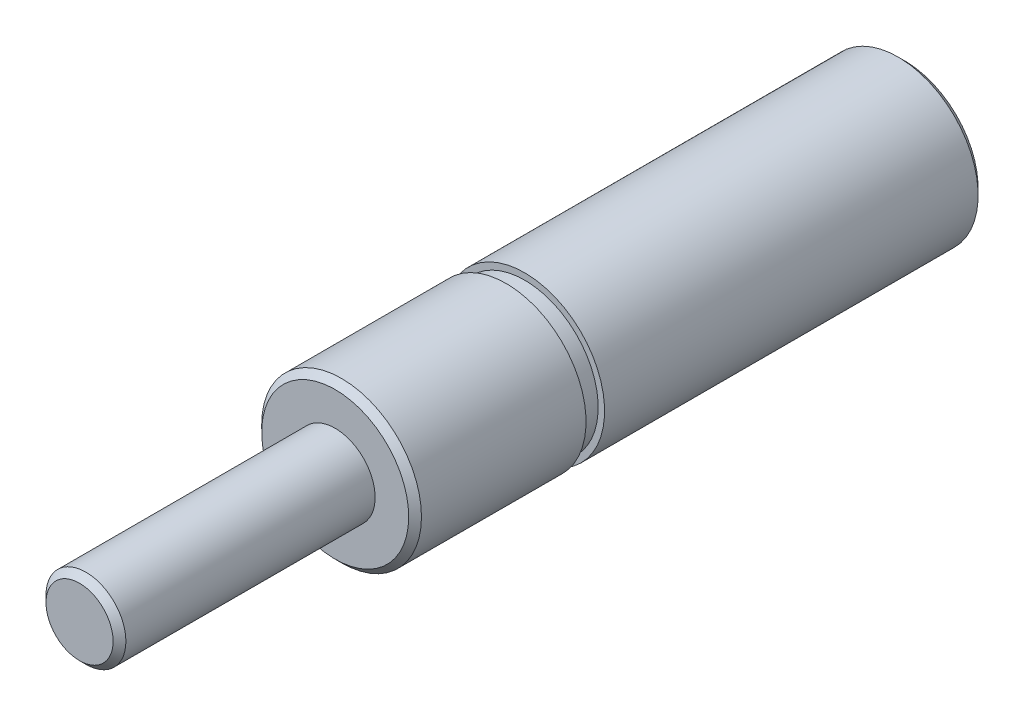
ISO-10303-21;
HEADER;
FILE_DESCRIPTION(('STEP AP214'),'2;1');
FILE_NAME('part.step','',(''),(''),'','','');
FILE_SCHEMA(('AUTOMOTIVE_DESIGN { 1 0 10303 214 1 1 1 1 }'));
ENDSEC;
DATA;
#1=APPLICATION_CONTEXT('core data for automotive mechanical design processes');
#2=APPLICATION_PROTOCOL_DEFINITION('international standard','automotive_design',2000,#1);
#3=PRODUCT_CONTEXT('',#1,'mechanical');
#4=PRODUCT('Part','Part','',(#3));
#5=PRODUCT_RELATED_PRODUCT_CATEGORY('part','',(#4));
#6=PRODUCT_DEFINITION_FORMATION('','',#4);
#7=PRODUCT_DEFINITION_CONTEXT('part definition',#1,'design');
#8=PRODUCT_DEFINITION('design','',#6,#7);
#9=PRODUCT_DEFINITION_SHAPE('','',#8);
#10=(LENGTH_UNIT() NAMED_UNIT(*) SI_UNIT(.MILLI.,.METRE.));
#11=(NAMED_UNIT(*) PLANE_ANGLE_UNIT() SI_UNIT($,.RADIAN.));
#12=(NAMED_UNIT(*) SI_UNIT($,.STERADIAN.) SOLID_ANGLE_UNIT());
#13=UNCERTAINTY_MEASURE_WITH_UNIT(LENGTH_MEASURE(1.E-05),#10,'distance_accuracy_value','');
#14=(GEOMETRIC_REPRESENTATION_CONTEXT(3) GLOBAL_UNCERTAINTY_ASSIGNED_CONTEXT((#13)) GLOBAL_UNIT_ASSIGNED_CONTEXT((#10,
#11,#12)) REPRESENTATION_CONTEXT('',''));
#15=CARTESIAN_POINT('',(0.,0.,0.));
#16=DIRECTION('',(0.,0.,1.));
#17=DIRECTION('',(1.,0.,0.));
#18=AXIS2_PLACEMENT_3D('',#15,#16,#17);
#19=CARTESIAN_POINT('',(0.,0.,0.));
#20=DIRECTION('',(0.,0.,1.));
#21=DIRECTION('',(1.,0.,0.));
#22=AXIS2_PLACEMENT_3D('',#19,#20,#21);
#23=PLANE('',#22);
#24=CARTESIAN_POINT('',(0.,0.,0.));
#25=DIRECTION('',(0.,0.,1.));
#26=DIRECTION('',(1.,0.,0.));
#27=AXIS2_PLACEMENT_3D('',#24,#25,#26);
#28=CIRCLE('',#27,1.3335);
#29=CARTESIAN_POINT('',(1.3335,0.,0.));
#30=VERTEX_POINT('',#29);
#31=EDGE_CURVE('E64',#30,#30,#28,.T.);
#32=ORIENTED_EDGE('',*,*,#31,.T.);
#33=EDGE_LOOP('',(#32));
#34=FACE_BOUND('',#33,.T.);
#35=ADVANCED_FACE('F44',(#34),#23,.T.);
#36=CARTESIAN_POINT('',(0.,0.,-26.4414));
#37=DIRECTION('',(0.,0.,-1.));
#38=DIRECTION('',(-1.,0.,0.));
#39=AXIS2_PLACEMENT_3D('',#36,#37,#38);
#40=CYLINDRICAL_SURFACE('',#39,1.5875);
#41=CARTESIAN_POINT('',(0.,0.,-0.254000000000001));
#42=DIRECTION('',(0.,0.,1.));
#43=DIRECTION('',(1.,0.,0.));
#44=AXIS2_PLACEMENT_3D('',#41,#42,#43);
#45=CIRCLE('',#44,1.5875);
#46=CARTESIAN_POINT('',(1.5875,0.,-0.254000000000001));
#47=VERTEX_POINT('',#46);
#48=EDGE_CURVE('E67',#47,#47,#45,.F.);
#49=ORIENTED_EDGE('',*,*,#48,.T.);
#50=EDGE_LOOP('',(#49));
#51=FACE_BOUND('',#50,.T.);
#52=CARTESIAN_POINT('',(0.,0.,-10.16));
#53=DIRECTION('',(0.,0.,-1.));
#54=DIRECTION('',(-1.,0.,0.));
#55=AXIS2_PLACEMENT_3D('',#52,#53,#54);
#56=CIRCLE('',#55,1.5875);
#57=CARTESIAN_POINT('',(-1.5875,0.,-10.16));
#58=VERTEX_POINT('',#57);
#59=EDGE_CURVE('E70',#58,#58,#56,.T.);
#60=ORIENTED_EDGE('',*,*,#59,.F.);
#61=EDGE_LOOP('',(#60));
#62=FACE_BOUND('',#61,.T.);
#63=ADVANCED_FACE('F108',(#51,#62),#40,.T.);
#64=CARTESIAN_POINT('',(0.,1.5875,-10.16));
#65=DIRECTION('',(0.,0.,1.));
#66=DIRECTION('',(1.,0.,0.));
#67=AXIS2_PLACEMENT_3D('',#64,#65,#66);
#68=PLANE('',#67);
#69=CARTESIAN_POINT('',(0.,0.,-10.16));
#70=DIRECTION('',(0.,0.,1.));
#71=DIRECTION('',(1.,0.,0.));
#72=AXIS2_PLACEMENT_3D('',#69,#70,#71);
#73=CIRCLE('',#72,2.921);
#74=CARTESIAN_POINT('',(2.921,0.,-10.16));
#75=VERTEX_POINT('',#74);
#76=EDGE_CURVE('E55',#75,#75,#73,.T.);
#77=ORIENTED_EDGE('',*,*,#76,.T.);
#78=EDGE_LOOP('',(#77));
#79=FACE_BOUND('',#78,.T.);
#80=ORIENTED_EDGE('',*,*,#59,.T.);
#81=EDGE_LOOP('',(#80));
#82=FACE_BOUND('',#81,.T.);
#83=ADVANCED_FACE('F114',(#79,#82),#68,.T.);
#84=CARTESIAN_POINT('',(0.,0.,-26.4414));
#85=DIRECTION('',(0.,0.,-1.));
#86=DIRECTION('',(-1.,0.,0.));
#87=AXIS2_PLACEMENT_3D('',#84,#85,#86);
#88=CYLINDRICAL_SURFACE('',#87,3.175);
#89=CARTESIAN_POINT('',(0.,0.,-10.414));
#90=DIRECTION('',(0.,0.,1.));
#91=DIRECTION('',(1.,0.,0.));
#92=AXIS2_PLACEMENT_3D('',#89,#90,#91);
#93=CIRCLE('',#92,3.175);
#94=CARTESIAN_POINT('',(3.175,0.,-10.414));
#95=VERTEX_POINT('',#94);
#96=EDGE_CURVE('E59',#95,#95,#93,.F.);
#97=ORIENTED_EDGE('',*,*,#96,.T.);
#98=EDGE_LOOP('',(#97));
#99=FACE_BOUND('',#98,.T.);
#100=CARTESIAN_POINT('',(0.,0.,-16.9545));
#101=DIRECTION('',(0.,0.,-1.));
#102=DIRECTION('',(-1.,0.,0.));
#103=AXIS2_PLACEMENT_3D('',#100,#101,#102);
#104=CIRCLE('',#103,3.175);
#105=CARTESIAN_POINT('',(-3.175,0.,-16.9545));
#106=VERTEX_POINT('',#105);
#107=EDGE_CURVE('E73',#106,#106,#104,.T.);
#108=ORIENTED_EDGE('',*,*,#107,.F.);
#109=EDGE_LOOP('',(#108));
#110=FACE_BOUND('',#109,.T.);
#111=ADVANCED_FACE('F132',(#99,#110),#88,.T.);
#112=CARTESIAN_POINT('',(0.,3.175,-16.9545));
#113=DIRECTION('',(0.,0.,-1.));
#114=DIRECTION('',(-1.,0.,0.));
#115=AXIS2_PLACEMENT_3D('',#112,#113,#114);
#116=PLANE('',#115);
#117=ORIENTED_EDGE('',*,*,#107,.T.);
#118=EDGE_LOOP('',(#117));
#119=FACE_BOUND('',#118,.T.);
#120=CARTESIAN_POINT('',(0.,0.,-16.9545));
#121=DIRECTION('',(0.,0.,-1.));
#122=DIRECTION('',(-1.,0.,0.));
#123=AXIS2_PLACEMENT_3D('',#120,#121,#122);
#124=CIRCLE('',#123,2.921);
#125=CARTESIAN_POINT('',(-2.921,0.,-16.9545));
#126=VERTEX_POINT('',#125);
#127=EDGE_CURVE('E76',#126,#126,#124,.T.);
#128=ORIENTED_EDGE('',*,*,#127,.F.);
#129=EDGE_LOOP('',(#128));
#130=FACE_BOUND('',#129,.T.);
#131=ADVANCED_FACE('F135',(#119,#130),#116,.T.);
#132=CARTESIAN_POINT('',(0.,0.,-26.4414));
#133=DIRECTION('',(0.,0.,-1.));
#134=DIRECTION('',(-1.,0.,0.));
#135=AXIS2_PLACEMENT_3D('',#132,#133,#134);
#136=CYLINDRICAL_SURFACE('',#135,2.921);
#137=ORIENTED_EDGE('',*,*,#127,.T.);
#138=EDGE_LOOP('',(#137));
#139=FACE_BOUND('',#138,.T.);
#140=CARTESIAN_POINT('',(0.,0.,-17.6911));
#141=DIRECTION('',(0.,0.,-1.));
#142=DIRECTION('',(-1.,0.,0.));
#143=AXIS2_PLACEMENT_3D('',#140,#141,#142);
#144=CIRCLE('',#143,2.921);
#145=CARTESIAN_POINT('',(-2.921,0.,-17.6911));
#146=VERTEX_POINT('',#145);
#147=EDGE_CURVE('E79',#146,#146,#144,.T.);
#148=ORIENTED_EDGE('',*,*,#147,.F.);
#149=EDGE_LOOP('',(#148));
#150=FACE_BOUND('',#149,.T.);
#151=ADVANCED_FACE('F141',(#139,#150),#136,.T.);
#152=CARTESIAN_POINT('',(0.,3.175,-17.6911));
#153=DIRECTION('',(0.,0.,1.));
#154=DIRECTION('',(1.,0.,0.));
#155=AXIS2_PLACEMENT_3D('',#152,#153,#154);
#156=PLANE('',#155);
#157=ORIENTED_EDGE('',*,*,#147,.T.);
#158=EDGE_LOOP('',(#157));
#159=FACE_BOUND('',#158,.T.);
#160=CARTESIAN_POINT('',(0.,0.,-17.6911));
#161=DIRECTION('',(0.,0.,-1.));
#162=DIRECTION('',(-1.,0.,0.));
#163=AXIS2_PLACEMENT_3D('',#160,#161,#162);
#164=CIRCLE('',#163,3.175);
#165=CARTESIAN_POINT('',(-3.175,0.,-17.6911));
#166=VERTEX_POINT('',#165);
#167=EDGE_CURVE('E82',#166,#166,#164,.T.);
#168=ORIENTED_EDGE('',*,*,#167,.F.);
#169=EDGE_LOOP('',(#168));
#170=FACE_BOUND('',#169,.T.);
#171=ADVANCED_FACE('F147',(#159,#170),#156,.T.);
#172=CARTESIAN_POINT('',(0.,0.,-26.4414));
#173=DIRECTION('',(0.,0.,-1.));
#174=DIRECTION('',(-1.,0.,0.));
#175=AXIS2_PLACEMENT_3D('',#172,#173,#174);
#176=CYLINDRICAL_SURFACE('',#175,3.175);
#177=CARTESIAN_POINT('',(0.,0.,-32.5374));
#178=DIRECTION('',(0.,0.,-1.));
#179=DIRECTION('',(-1.,0.,0.));
#180=AXIS2_PLACEMENT_3D('',#177,#178,#179);
#181=CIRCLE('',#180,3.175);
#182=CARTESIAN_POINT('',(-3.175,0.,-32.5374));
#183=VERTEX_POINT('',#182);
#184=EDGE_CURVE('E12',#183,#183,#181,.F.);
#185=ORIENTED_EDGE('',*,*,#184,.T.);
#186=EDGE_LOOP('',(#185));
#187=FACE_BOUND('',#186,.T.);
#188=ORIENTED_EDGE('',*,*,#167,.T.);
#189=EDGE_LOOP('',(#188));
#190=FACE_BOUND('',#189,.T.);
#191=ADVANCED_FACE('F105',(#187,#190),#176,.T.);
#192=CARTESIAN_POINT('',(0.,3.175,-32.7914));
#193=DIRECTION('',(0.,0.,-1.));
#194=DIRECTION('',(-1.,0.,0.));
#195=AXIS2_PLACEMENT_3D('',#192,#193,#194);
#196=PLANE('',#195);
#197=CARTESIAN_POINT('',(0.,0.,-32.7914));
#198=DIRECTION('',(0.,0.,-1.));
#199=DIRECTION('',(-1.,0.,0.));
#200=AXIS2_PLACEMENT_3D('',#197,#198,#199);
#201=CIRCLE('',#200,2.92099999999999);
#202=CARTESIAN_POINT('',(-2.92099999999999,0.,-32.7914));
#203=VERTEX_POINT('',#202);
#204=EDGE_CURVE('E51',#203,#203,#201,.T.);
#205=ORIENTED_EDGE('',*,*,#204,.T.);
#206=EDGE_LOOP('',(#205));
#207=FACE_BOUND('',#206,.T.);
#208=CARTESIAN_POINT('',(0.,0.,-32.7914));
#209=DIRECTION('',(0.,0.,-1.));
#210=DIRECTION('',(-1.,0.,0.));
#211=AXIS2_PLACEMENT_3D('',#208,#209,#210);
#212=CIRCLE('',#211,1.5875);
#213=CARTESIAN_POINT('',(-1.5875,0.,-32.7914));
#214=VERTEX_POINT('',#213);
#215=EDGE_CURVE('E85',#214,#214,#212,.T.);
#216=ORIENTED_EDGE('',*,*,#215,.F.);
#217=EDGE_LOOP('',(#216));
#218=FACE_BOUND('',#217,.T.);
#219=ADVANCED_FACE('F96',(#207,#218),#196,.T.);
#220=CARTESIAN_POINT('',(0.,0.,-26.4414));
#221=DIRECTION('',(0.,0.,-1.));
#222=DIRECTION('',(-1.,0.,0.));
#223=AXIS2_PLACEMENT_3D('',#220,#221,#222);
#224=CYLINDRICAL_SURFACE('',#223,1.5875);
#225=ORIENTED_EDGE('',*,*,#215,.T.);
#226=EDGE_LOOP('',(#225));
#227=FACE_BOUND('',#226,.T.);
#228=CARTESIAN_POINT('',(0.,0.,-26.4414));
#229=DIRECTION('',(0.,0.,-1.));
#230=DIRECTION('',(-1.,0.,0.));
#231=AXIS2_PLACEMENT_3D('',#228,#229,#230);
#232=CIRCLE('',#231,1.5875);
#233=CARTESIAN_POINT('',(-1.5875,0.,-26.4414));
#234=VERTEX_POINT('',#233);
#235=EDGE_CURVE('E88',#234,#234,#232,.T.);
#236=ORIENTED_EDGE('',*,*,#235,.F.);
#237=EDGE_LOOP('',(#236));
#238=FACE_BOUND('',#237,.T.);
#239=ADVANCED_FACE('F94',(#227,#238),#224,.F.);
#240=CARTESIAN_POINT('',(0.,1.5875,-26.4414));
#241=DIRECTION('',(0.,0.,-1.));
#242=DIRECTION('',(-1.,0.,0.));
#243=AXIS2_PLACEMENT_3D('',#240,#241,#242);
#244=PLANE('',#243);
#245=ORIENTED_EDGE('',*,*,#235,.T.);
#246=EDGE_LOOP('',(#245));
#247=FACE_BOUND('',#246,.T.);
#248=ADVANCED_FACE('F92',(#247),#244,.T.);
#249=CARTESIAN_POINT('',(0.,0.,-0.254000000000001));
#250=DIRECTION('',(0.,0.,-1.));
#251=DIRECTION('',(-1.,0.,0.));
#252=AXIS2_PLACEMENT_3D('',#249,#250,#251);
#253=CONICAL_SURFACE('',#252,1.5875,0.78539816339745);
#254=ORIENTED_EDGE('',*,*,#31,.F.);
#255=EDGE_LOOP('',(#254));
#256=FACE_BOUND('',#255,.T.);
#257=ORIENTED_EDGE('',*,*,#48,.F.);
#258=EDGE_LOOP('',(#257));
#259=FACE_BOUND('',#258,.T.);
#260=ADVANCED_FACE('F103',(#256,#259),#253,.T.);
#261=CARTESIAN_POINT('',(0.,0.,-10.414));
#262=DIRECTION('',(0.,0.,-1.));
#263=DIRECTION('',(-1.,0.,0.));
#264=AXIS2_PLACEMENT_3D('',#261,#262,#263);
#265=CONICAL_SURFACE('',#264,3.175,0.785398163397459);
#266=ORIENTED_EDGE('',*,*,#76,.F.);
#267=EDGE_LOOP('',(#266));
#268=FACE_BOUND('',#267,.T.);
#269=ORIENTED_EDGE('',*,*,#96,.F.);
#270=EDGE_LOOP('',(#269));
#271=FACE_BOUND('',#270,.T.);
#272=ADVANCED_FACE('F120',(#268,#271),#265,.T.);
#273=CARTESIAN_POINT('',(0.,0.,-32.7914));
#274=DIRECTION('',(0.,0.,1.));
#275=DIRECTION('',(1.,0.,0.));
#276=AXIS2_PLACEMENT_3D('',#273,#274,#275);
#277=CONICAL_SURFACE('',#276,2.92099999999999,0.785398163397447);
#278=ORIENTED_EDGE('',*,*,#184,.F.);
#279=EDGE_LOOP('',(#278));
#280=FACE_BOUND('',#279,.T.);
#281=ORIENTED_EDGE('',*,*,#204,.F.);
#282=EDGE_LOOP('',(#281));
#283=FACE_BOUND('',#282,.T.);
#284=ADVANCED_FACE('F46',(#280,#283),#277,.T.);
#285=CLOSED_SHELL('',(#35,#63,#83,#111,#131,#151,#171,#191,#219,#239,#248,#260,#272,#284));
#286=MANIFOLD_SOLID_BREP('B2',#285);
#287=ADVANCED_BREP_SHAPE_REPRESENTATION('',(#18,#286),#14);
#288=SHAPE_DEFINITION_REPRESENTATION(#9,#287);
ENDSEC;
END-ISO-10303-21;
